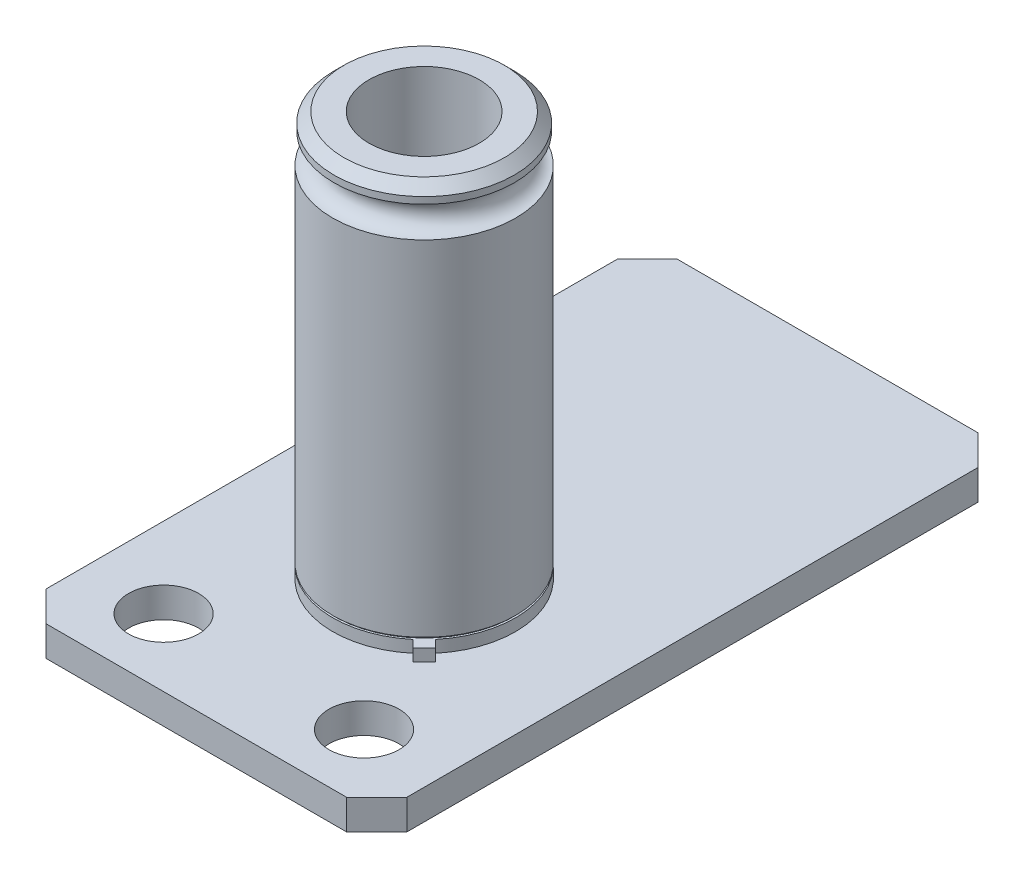
ISO-10303-21;
HEADER;
FILE_DESCRIPTION(('STEP AP214'),'2;1');
FILE_NAME('part.step','',(''),(''),'','','');
FILE_SCHEMA(('AUTOMOTIVE_DESIGN { 1 0 10303 214 1 1 1 1 }'));
ENDSEC;
DATA;
#1=APPLICATION_CONTEXT('core data for automotive mechanical design processes');
#2=APPLICATION_PROTOCOL_DEFINITION('international standard','automotive_design',2000,#1);
#3=PRODUCT_CONTEXT('',#1,'mechanical');
#4=PRODUCT('Part','Part','',(#3));
#5=PRODUCT_RELATED_PRODUCT_CATEGORY('part','',(#4));
#6=PRODUCT_DEFINITION_FORMATION('','',#4);
#7=PRODUCT_DEFINITION_CONTEXT('part definition',#1,'design');
#8=PRODUCT_DEFINITION('design','',#6,#7);
#9=PRODUCT_DEFINITION_SHAPE('','',#8);
#10=(LENGTH_UNIT() NAMED_UNIT(*) SI_UNIT(.MILLI.,.METRE.));
#11=(NAMED_UNIT(*) PLANE_ANGLE_UNIT() SI_UNIT($,.RADIAN.));
#12=(NAMED_UNIT(*) SI_UNIT($,.STERADIAN.) SOLID_ANGLE_UNIT());
#13=UNCERTAINTY_MEASURE_WITH_UNIT(LENGTH_MEASURE(1.E-05),#10,'distance_accuracy_value','');
#14=(GEOMETRIC_REPRESENTATION_CONTEXT(3) GLOBAL_UNCERTAINTY_ASSIGNED_CONTEXT((#13)) GLOBAL_UNIT_ASSIGNED_CONTEXT((#10,
#11,#12)) REPRESENTATION_CONTEXT('',''));
#15=CARTESIAN_POINT('',(0.,0.,0.));
#16=DIRECTION('',(0.,0.,1.));
#17=DIRECTION('',(1.,0.,0.));
#18=AXIS2_PLACEMENT_3D('',#15,#16,#17);
#19=CARTESIAN_POINT('',(-4.46,0.,0.));
#20=DIRECTION('',(0.,1.,0.));
#21=DIRECTION('',(-1.,0.,0.));
#22=AXIS2_PLACEMENT_3D('',#19,#20,#21);
#23=PLANE('',#22);
#24=CARTESIAN_POINT('',(0.,0.,0.));
#25=DIRECTION('',(0.,1.,0.));
#26=DIRECTION('',(-1.,0.,0.));
#27=AXIS2_PLACEMENT_3D('',#24,#25,#26);
#28=CIRCLE('',#27,4.46);
#29=CARTESIAN_POINT('',(-4.46,0.,0.));
#30=VERTEX_POINT('',#29);
#31=EDGE_CURVE('E223',#30,#30,#28,.T.);
#32=ORIENTED_EDGE('',*,*,#31,.T.);
#33=EDGE_LOOP('',(#32));
#34=FACE_BOUND('',#33,.T.);
#35=ADVANCED_FACE('F43',(#34),#23,.T.);
#36=CARTESIAN_POINT('',(0.,0.,0.));
#37=DIRECTION('',(0.,1.,0.));
#38=DIRECTION('',(-1.,0.,0.));
#39=AXIS2_PLACEMENT_3D('',#36,#37,#38);
#40=CYLINDRICAL_SURFACE('',#39,4.56);
#41=DIRECTION('',(0.,1.,0.));
#42=VECTOR('',#41,1.);
#43=CARTESIAN_POINT('',(2.92913487150693,0.,3.49482029645618));
#44=LINE('',#43,#42);
#45=CARTESIAN_POINT('',(2.92913487150693,-0.0999999999999991,3.49482029645618));
#46=VERTEX_POINT('',#45);
#47=CARTESIAN_POINT('',(2.92913487150693,-0.699999999999999,3.49482029645618));
#48=VERTEX_POINT('',#47);
#49=EDGE_CURVE('E220',#46,#48,#44,.F.);
#50=ORIENTED_EDGE('',*,*,#49,.F.);
#51=CARTESIAN_POINT('',(0.,-0.0999999999999995,0.));
#52=DIRECTION('',(0.,1.,0.));
#53=DIRECTION('',(-1.,0.,0.));
#54=AXIS2_PLACEMENT_3D('',#51,#52,#53);
#55=CIRCLE('',#54,4.56);
#56=CARTESIAN_POINT('',(3.49482029645617,-0.099999999999999,2.92913487150694));
#57=VERTEX_POINT('',#56);
#58=EDGE_CURVE('E229',#57,#46,#55,.T.);
#59=ORIENTED_EDGE('',*,*,#58,.F.);
#60=DIRECTION('',(0.,1.,0.));
#61=VECTOR('',#60,1.);
#62=CARTESIAN_POINT('',(3.49482029645617,0.,2.92913487150694));
#63=LINE('',#62,#61);
#64=CARTESIAN_POINT('',(3.49482029645617,-0.699999999999999,2.92913487150694));
#65=VERTEX_POINT('',#64);
#66=EDGE_CURVE('E217',#65,#57,#63,.T.);
#67=ORIENTED_EDGE('',*,*,#66,.F.);
#68=CARTESIAN_POINT('',(0.,-0.699999999999999,0.));
#69=DIRECTION('',(0.,1.,0.));
#70=DIRECTION('',(-1.,0.,0.));
#71=AXIS2_PLACEMENT_3D('',#68,#69,#70);
#72=CIRCLE('',#71,4.56);
#73=EDGE_CURVE('E232',#65,#48,#72,.T.);
#74=ORIENTED_EDGE('',*,*,#73,.T.);
#75=EDGE_LOOP('',(#50,#59,#67,#74));
#76=FACE_BOUND('',#75,.T.);
#77=ADVANCED_FACE('F341',(#76),#40,.T.);
#78=CARTESIAN_POINT('',(-4.56,-0.1,0.));
#79=DIRECTION('',(0.,1.,0.));
#80=DIRECTION('',(-1.,0.,0.));
#81=AXIS2_PLACEMENT_3D('',#78,#79,#80);
#82=PLANE('',#81);
#83=ORIENTED_EDGE('',*,*,#58,.T.);
#84=DIRECTION('',(-0.707106781186546,0.,-0.707106781186549));
#85=VECTOR('',#84,1.);
#86=CARTESIAN_POINT('',(-0.28284271247462,-0.0999999999999994,0.282842712474618));
#87=LINE('',#86,#85);
#88=CARTESIAN_POINT('',(3.2951176003293,-0.099999999999999,3.86080302527856));
#89=VERTEX_POINT('',#88);
#90=EDGE_CURVE('E202',#89,#46,#87,.T.);
#91=ORIENTED_EDGE('',*,*,#90,.F.);
#92=DIRECTION('',(-0.70710678118655,0.,0.707106781186545));
#93=VECTOR('',#92,1.);
#94=CARTESIAN_POINT('',(3.86080302527854,-0.0999999999999994,3.29511760032932));
#95=LINE('',#94,#93);
#96=CARTESIAN_POINT('',(3.86080302527854,-0.099999999999999,3.29511760032932));
#97=VERTEX_POINT('',#96);
#98=EDGE_CURVE('E208',#97,#89,#95,.T.);
#99=ORIENTED_EDGE('',*,*,#98,.F.);
#100=DIRECTION('',(0.707106781186546,0.,0.707106781186549));
#101=VECTOR('',#100,1.);
#102=CARTESIAN_POINT('',(0.28284271247462,-0.0999999999999994,-0.282842712474618));
#103=LINE('',#102,#101);
#104=EDGE_CURVE('E207',#57,#97,#103,.T.);
#105=ORIENTED_EDGE('',*,*,#104,.F.);
#106=EDGE_LOOP('',(#83,#91,#99,#105));
#107=FACE_BOUND('',#106,.T.);
#108=CARTESIAN_POINT('',(0.,-0.0999999999999995,0.));
#109=DIRECTION('',(0.,1.,0.));
#110=DIRECTION('',(-1.,0.,0.));
#111=AXIS2_PLACEMENT_3D('',#108,#109,#110);
#112=CIRCLE('',#111,4.46);
#113=CARTESIAN_POINT('',(-4.46,-0.1,0.));
#114=VERTEX_POINT('',#113);
#115=EDGE_CURVE('E226',#114,#114,#112,.T.);
#116=ORIENTED_EDGE('',*,*,#115,.F.);
#117=EDGE_LOOP('',(#116));
#118=FACE_BOUND('',#117,.T.);
#119=ADVANCED_FACE('F346',(#107,#118),#82,.T.);
#120=CARTESIAN_POINT('',(0.,0.,0.));
#121=DIRECTION('',(0.,1.,0.));
#122=DIRECTION('',(-1.,0.,0.));
#123=AXIS2_PLACEMENT_3D('',#120,#121,#122);
#124=CYLINDRICAL_SURFACE('',#123,4.46);
#125=ORIENTED_EDGE('',*,*,#115,.T.);
#126=EDGE_LOOP('',(#125));
#127=FACE_BOUND('',#126,.T.);
#128=ORIENTED_EDGE('',*,*,#31,.F.);
#129=EDGE_LOOP('',(#128));
#130=FACE_BOUND('',#129,.T.);
#131=ADVANCED_FACE('F350',(#127,#130),#124,.T.);
#132=CARTESIAN_POINT('',(-0.28284271247462,5.76,0.282842712474618));
#133=DIRECTION('',(-0.707106781186549,0.,0.707106781186546));
#134=DIRECTION('',(0.707106781186546,0.,0.707106781186549));
#135=AXIS2_PLACEMENT_3D('',#132,#133,#134);
#136=PLANE('',#135);
#137=ORIENTED_EDGE('',*,*,#90,.T.);
#138=ORIENTED_EDGE('',*,*,#49,.T.);
#139=DIRECTION('',(-0.707106781186546,0.,-0.707106781186549));
#140=VECTOR('',#139,1.);
#141=CARTESIAN_POINT('',(-0.282842712474619,-0.699999999999999,0.282842712474618));
#142=LINE('',#141,#140);
#143=CARTESIAN_POINT('',(3.2951176003293,-0.699999999999999,3.86080302527856));
#144=VERTEX_POINT('',#143);
#145=EDGE_CURVE('E198',#144,#48,#142,.T.);
#146=ORIENTED_EDGE('',*,*,#145,.F.);
#147=DIRECTION('',(0.,-1.,0.));
#148=VECTOR('',#147,1.);
#149=CARTESIAN_POINT('',(3.2951176003293,5.76,3.86080302527856));
#150=LINE('',#149,#148);
#151=EDGE_CURVE('E211',#89,#144,#150,.T.);
#152=ORIENTED_EDGE('',*,*,#151,.F.);
#153=EDGE_LOOP('',(#137,#138,#146,#152));
#154=FACE_BOUND('',#153,.T.);
#155=ADVANCED_FACE('F352',(#154),#136,.T.);
#156=CARTESIAN_POINT('',(0.282842712474619,5.76,-0.282842712474618));
#157=DIRECTION('',(0.707106781186549,0.,-0.707106781186546));
#158=DIRECTION('',(-0.707106781186546,0.,-0.707106781186549));
#159=AXIS2_PLACEMENT_3D('',#156,#157,#158);
#160=PLANE('',#159);
#161=DIRECTION('',(0.707106781186546,0.,0.707106781186549));
#162=VECTOR('',#161,1.);
#163=CARTESIAN_POINT('',(0.28284271247462,-0.699999999999999,-0.282842712474618));
#164=LINE('',#163,#162);
#165=CARTESIAN_POINT('',(3.86080302527854,-0.699999999999999,3.29511760032932));
#166=VERTEX_POINT('',#165);
#167=EDGE_CURVE('E199',#65,#166,#164,.T.);
#168=ORIENTED_EDGE('',*,*,#167,.F.);
#169=ORIENTED_EDGE('',*,*,#66,.T.);
#170=ORIENTED_EDGE('',*,*,#104,.T.);
#171=DIRECTION('',(0.,-1.,0.));
#172=VECTOR('',#171,1.);
#173=CARTESIAN_POINT('',(3.86080302527854,5.76,3.29511760032932));
#174=LINE('',#173,#172);
#175=EDGE_CURVE('E212',#97,#166,#174,.T.);
#176=ORIENTED_EDGE('',*,*,#175,.T.);
#177=EDGE_LOOP('',(#168,#169,#170,#176));
#178=FACE_BOUND('',#177,.T.);
#179=ADVANCED_FACE('F359',(#178),#160,.T.);
#180=CARTESIAN_POINT('',(3.86080302527854,5.76,3.29511760032932));
#181=DIRECTION('',(0.707106781186545,0.,0.70710678118655));
#182=DIRECTION('',(0.70710678118655,0.,-0.707106781186545));
#183=AXIS2_PLACEMENT_3D('',#180,#181,#182);
#184=PLANE('',#183);
#185=ORIENTED_EDGE('',*,*,#175,.F.);
#186=ORIENTED_EDGE('',*,*,#98,.T.);
#187=ORIENTED_EDGE('',*,*,#151,.T.);
#188=DIRECTION('',(-0.70710678118655,0.,0.707106781186545));
#189=VECTOR('',#188,1.);
#190=CARTESIAN_POINT('',(3.86080302527854,-0.699999999999999,3.29511760032932));
#191=LINE('',#190,#189);
#192=EDGE_CURVE('E195',#166,#144,#191,.T.);
#193=ORIENTED_EDGE('',*,*,#192,.F.);
#194=EDGE_LOOP('',(#185,#186,#187,#193));
#195=FACE_BOUND('',#194,.T.);
#196=ADVANCED_FACE('F367',(#195),#184,.T.);
#197=CARTESIAN_POINT('',(9.,-2.2,11.3671159111135));
#198=DIRECTION('',(0.,0.,-1.));
#199=DIRECTION('',(-1.,0.,0.));
#200=AXIS2_PLACEMENT_3D('',#197,#198,#199);
#201=PLANE('',#200);
#202=DIRECTION('',(-1.,0.,0.));
#203=VECTOR('',#202,1.);
#204=CARTESIAN_POINT('',(9.,-2.2,11.3671159111135));
#205=LINE('',#204,#203);
#206=CARTESIAN_POINT('',(7.50000000000001,-2.2,11.3671159111135));
#207=VERTEX_POINT('',#206);
#208=CARTESIAN_POINT('',(-7.5,-2.2,11.3671159111135));
#209=VERTEX_POINT('',#208);
#210=EDGE_CURVE('E170',#207,#209,#205,.T.);
#211=ORIENTED_EDGE('',*,*,#210,.F.);
#212=DIRECTION('',(0.,1.,0.));
#213=VECTOR('',#212,1.);
#214=CARTESIAN_POINT('',(7.50000000000001,-14.2,11.3671159111135));
#215=LINE('',#214,#213);
#216=CARTESIAN_POINT('',(7.50000000000001,-0.699999999999998,11.3671159111135));
#217=VERTEX_POINT('',#216);
#218=EDGE_CURVE('E57',#207,#217,#215,.T.);
#219=ORIENTED_EDGE('',*,*,#218,.T.);
#220=DIRECTION('',(-1.,0.,0.));
#221=VECTOR('',#220,1.);
#222=CARTESIAN_POINT('',(9.,-0.699999999999998,11.3671159111135));
#223=LINE('',#222,#221);
#224=CARTESIAN_POINT('',(-7.5,-0.7,11.3671159111135));
#225=VERTEX_POINT('',#224);
#226=EDGE_CURVE('E146',#217,#225,#223,.T.);
#227=ORIENTED_EDGE('',*,*,#226,.T.);
#228=DIRECTION('',(0.,1.,0.));
#229=VECTOR('',#228,1.);
#230=CARTESIAN_POINT('',(-7.5,-14.2,11.3671159111135));
#231=LINE('',#230,#229);
#232=EDGE_CURVE('E305',#209,#225,#231,.T.);
#233=ORIENTED_EDGE('',*,*,#232,.F.);
#234=EDGE_LOOP('',(#211,#219,#227,#233));
#235=FACE_BOUND('',#234,.T.);
#236=ADVANCED_FACE('F321',(#235),#201,.F.);
#237=CARTESIAN_POINT('',(9.,-2.2,-11.3671159111135));
#238=DIRECTION('',(-1.,0.,0.));
#239=DIRECTION('',(0.,0.,1.));
#240=AXIS2_PLACEMENT_3D('',#237,#238,#239);
#241=PLANE('',#240);
#242=DIRECTION('',(0.,0.,1.));
#243=VECTOR('',#242,1.);
#244=CARTESIAN_POINT('',(9.,-0.699999999999998,-11.3671159111135));
#245=LINE('',#244,#243);
#246=CARTESIAN_POINT('',(9.00000000000001,-0.699999999999998,-18.6328840888865));
#247=VERTEX_POINT('',#246);
#248=CARTESIAN_POINT('',(9.00000000000001,-0.699999999999998,9.86711591111348));
#249=VERTEX_POINT('',#248);
#250=EDGE_CURVE('E144',#247,#249,#245,.T.);
#251=ORIENTED_EDGE('',*,*,#250,.T.);
#252=DIRECTION('',(0.,1.,0.));
#253=VECTOR('',#252,1.);
#254=CARTESIAN_POINT('',(9.00000000000001,-14.2,9.86711591111348));
#255=LINE('',#254,#253);
#256=CARTESIAN_POINT('',(9.00000000000001,-2.2,9.86711591111348));
#257=VERTEX_POINT('',#256);
#258=EDGE_CURVE('E129',#257,#249,#255,.T.);
#259=ORIENTED_EDGE('',*,*,#258,.F.);
#260=DIRECTION('',(0.,0.,1.));
#261=VECTOR('',#260,1.);
#262=CARTESIAN_POINT('',(9.,-2.2,-11.3671159111135));
#263=LINE('',#262,#261);
#264=CARTESIAN_POINT('',(9.,-2.2,-18.6328840888865));
#265=VERTEX_POINT('',#264);
#266=EDGE_CURVE('E279',#265,#257,#263,.T.);
#267=ORIENTED_EDGE('',*,*,#266,.F.);
#268=DIRECTION('',(0.,1.,0.));
#269=VECTOR('',#268,1.);
#270=CARTESIAN_POINT('',(9.00000000000001,-14.2,-18.6328840888865));
#271=LINE('',#270,#269);
#272=EDGE_CURVE('E65',#265,#247,#271,.T.);
#273=ORIENTED_EDGE('',*,*,#272,.T.);
#274=EDGE_LOOP('',(#251,#259,#267,#273));
#275=FACE_BOUND('',#274,.T.);
#276=ADVANCED_FACE('F148',(#275),#241,.F.);
#277=CARTESIAN_POINT('',(-9.,-2.2,-20.1328840888865));
#278=DIRECTION('',(0.,0.,1.));
#279=DIRECTION('',(1.,0.,0.));
#280=AXIS2_PLACEMENT_3D('',#277,#278,#279);
#281=PLANE('',#280);
#282=DIRECTION('',(1.,0.,0.));
#283=VECTOR('',#282,1.);
#284=CARTESIAN_POINT('',(-9.,-0.7,-20.1328840888865));
#285=LINE('',#284,#283);
#286=CARTESIAN_POINT('',(-7.5,-0.7,-20.1328840888865));
#287=VERTEX_POINT('',#286);
#288=CARTESIAN_POINT('',(7.50000000000001,-0.699999999999998,-20.1328840888865));
#289=VERTEX_POINT('',#288);
#290=EDGE_CURVE('E149',#287,#289,#285,.T.);
#291=ORIENTED_EDGE('',*,*,#290,.T.);
#292=DIRECTION('',(0.,1.,0.));
#293=VECTOR('',#292,1.);
#294=CARTESIAN_POINT('',(7.50000000000001,-14.2,-20.1328840888865));
#295=LINE('',#294,#293);
#296=CARTESIAN_POINT('',(7.50000000000001,-2.2,-20.1328840888865));
#297=VERTEX_POINT('',#296);
#298=EDGE_CURVE('E264',#297,#289,#295,.T.);
#299=ORIENTED_EDGE('',*,*,#298,.F.);
#300=DIRECTION('',(1.,0.,0.));
#301=VECTOR('',#300,1.);
#302=CARTESIAN_POINT('',(-9.,-2.2,-20.1328840888865));
#303=LINE('',#302,#301);
#304=CARTESIAN_POINT('',(-7.5,-2.2,-20.1328840888865));
#305=VERTEX_POINT('',#304);
#306=EDGE_CURVE('E271',#305,#297,#303,.T.);
#307=ORIENTED_EDGE('',*,*,#306,.F.);
#308=DIRECTION('',(0.,1.,0.));
#309=VECTOR('',#308,1.);
#310=CARTESIAN_POINT('',(-7.5,-14.2,-20.1328840888865));
#311=LINE('',#310,#309);
#312=EDGE_CURVE('E313',#305,#287,#311,.T.);
#313=ORIENTED_EDGE('',*,*,#312,.T.);
#314=EDGE_LOOP('',(#291,#299,#307,#313));
#315=FACE_BOUND('',#314,.T.);
#316=ADVANCED_FACE('F269',(#315),#281,.F.);
#317=CARTESIAN_POINT('',(0.,-0.699999999999999,0.));
#318=DIRECTION('',(0.,-1.,0.));
#319=DIRECTION('',(1.,0.,0.));
#320=AXIS2_PLACEMENT_3D('',#317,#318,#319);
#321=PLANE('',#320);
#322=CARTESIAN_POINT('',(5.,-0.699999999999999,8.));
#323=DIRECTION('',(0.,1.,0.));
#324=DIRECTION('',(-1.,0.,0.));
#325=AXIS2_PLACEMENT_3D('',#322,#323,#324);
#326=CIRCLE('',#325,1.75);
#327=CARTESIAN_POINT('',(3.25,-0.699999999999999,8.));
#328=VERTEX_POINT('',#327);
#329=EDGE_CURVE('E258',#328,#328,#326,.T.);
#330=ORIENTED_EDGE('',*,*,#329,.F.);
#331=EDGE_LOOP('',(#330));
#332=FACE_BOUND('',#331,.T.);
#333=CARTESIAN_POINT('',(-5.,-0.7,8.));
#334=DIRECTION('',(0.,1.,0.));
#335=DIRECTION('',(-1.,0.,0.));
#336=AXIS2_PLACEMENT_3D('',#333,#334,#335);
#337=CIRCLE('',#336,1.75);
#338=CARTESIAN_POINT('',(-6.75,-0.7,8.));
#339=VERTEX_POINT('',#338);
#340=EDGE_CURVE('E254',#339,#339,#337,.T.);
#341=ORIENTED_EDGE('',*,*,#340,.F.);
#342=EDGE_LOOP('',(#341));
#343=FACE_BOUND('',#342,.T.);
#344=ORIENTED_EDGE('',*,*,#226,.F.);
#345=DIRECTION('',(-0.707106781186548,0.,0.707106781186548));
#346=VECTOR('',#345,1.);
#347=CARTESIAN_POINT('',(9.00000000000001,-0.699999999999998,9.86711591111348));
#348=LINE('',#347,#346);
#349=EDGE_CURVE('E132',#249,#217,#348,.T.);
#350=ORIENTED_EDGE('',*,*,#349,.F.);
#351=ORIENTED_EDGE('',*,*,#250,.F.);
#352=DIRECTION('',(0.707106781186546,0.,0.707106781186549));
#353=VECTOR('',#352,1.);
#354=CARTESIAN_POINT('',(9.00000000000001,-0.699999999999998,-18.6328840888865));
#355=LINE('',#354,#353);
#356=EDGE_CURVE('E273',#289,#247,#355,.T.);
#357=ORIENTED_EDGE('',*,*,#356,.F.);
#358=ORIENTED_EDGE('',*,*,#290,.F.);
#359=DIRECTION('',(0.707106781186548,0.,-0.707106781186547));
#360=VECTOR('',#359,1.);
#361=CARTESIAN_POINT('',(-9.,-0.7,-18.6328840888865));
#362=LINE('',#361,#360);
#363=CARTESIAN_POINT('',(-9.,-0.7,-18.6328840888865));
#364=VERTEX_POINT('',#363);
#365=EDGE_CURVE('E314',#364,#287,#362,.T.);
#366=ORIENTED_EDGE('',*,*,#365,.F.);
#367=DIRECTION('',(0.,0.,-1.));
#368=VECTOR('',#367,1.);
#369=CARTESIAN_POINT('',(-9.,-0.7,-14.7227108509228));
#370=LINE('',#369,#368);
#371=CARTESIAN_POINT('',(-9.,-0.7,9.86711591111348));
#372=VERTEX_POINT('',#371);
#373=EDGE_CURVE('E154',#372,#364,#370,.T.);
#374=ORIENTED_EDGE('',*,*,#373,.F.);
#375=DIRECTION('',(-0.707106781186548,0.,-0.707106781186548));
#376=VECTOR('',#375,1.);
#377=CARTESIAN_POINT('',(-9.,-0.7,9.86711591111348));
#378=LINE('',#377,#376);
#379=EDGE_CURVE('E308',#225,#372,#378,.T.);
#380=ORIENTED_EDGE('',*,*,#379,.F.);
#381=EDGE_LOOP('',(#344,#350,#351,#357,#358,#366,#374,#380));
#382=FACE_BOUND('',#381,.T.);
#383=ORIENTED_EDGE('',*,*,#73,.F.);
#384=ORIENTED_EDGE('',*,*,#167,.T.);
#385=ORIENTED_EDGE('',*,*,#192,.T.);
#386=ORIENTED_EDGE('',*,*,#145,.T.);
#387=EDGE_LOOP('',(#383,#384,#385,#386));
#388=FACE_BOUND('',#387,.T.);
#389=ADVANCED_FACE('F141',(#332,#343,#382,#388),#321,.F.);
#390=CARTESIAN_POINT('',(-9.,-2.2,-14.7227108509228));
#391=DIRECTION('',(1.,0.,0.));
#392=DIRECTION('',(0.,0.,-1.));
#393=AXIS2_PLACEMENT_3D('',#390,#391,#392);
#394=PLANE('',#393);
#395=ORIENTED_EDGE('',*,*,#373,.T.);
#396=DIRECTION('',(0.,1.,0.));
#397=VECTOR('',#396,1.);
#398=CARTESIAN_POINT('',(-9.,-14.2,-18.6328840888865));
#399=LINE('',#398,#397);
#400=CARTESIAN_POINT('',(-9.,-2.2,-18.6328840888865));
#401=VERTEX_POINT('',#400);
#402=EDGE_CURVE('E311',#401,#364,#399,.T.);
#403=ORIENTED_EDGE('',*,*,#402,.F.);
#404=DIRECTION('',(0.,0.,-1.));
#405=VECTOR('',#404,1.);
#406=CARTESIAN_POINT('',(-9.,-2.2,-14.7227108509228));
#407=LINE('',#406,#405);
#408=CARTESIAN_POINT('',(-9.00000000000001,-2.2,9.86711591111347));
#409=VERTEX_POINT('',#408);
#410=EDGE_CURVE('E151',#409,#401,#407,.T.);
#411=ORIENTED_EDGE('',*,*,#410,.F.);
#412=DIRECTION('',(0.,1.,0.));
#413=VECTOR('',#412,1.);
#414=CARTESIAN_POINT('',(-9.,-14.2,9.86711591111348));
#415=LINE('',#414,#413);
#416=EDGE_CURVE('E304',#409,#372,#415,.T.);
#417=ORIENTED_EDGE('',*,*,#416,.T.);
#418=EDGE_LOOP('',(#395,#403,#411,#417));
#419=FACE_BOUND('',#418,.T.);
#420=ADVANCED_FACE('F327',(#419),#394,.F.);
#421=CARTESIAN_POINT('',(0.,-2.2,0.));
#422=DIRECTION('',(0.,-1.,0.));
#423=DIRECTION('',(1.,0.,0.));
#424=AXIS2_PLACEMENT_3D('',#421,#422,#423);
#425=PLANE('',#424);
#426=DIRECTION('',(0.707106781186548,0.,-0.707106781186548));
#427=VECTOR('',#426,1.);
#428=CARTESIAN_POINT('',(9.43355795555674,-2.2,9.43355795555674));
#429=LINE('',#428,#427);
#430=EDGE_CURVE('E12',#207,#257,#429,.T.);
#431=ORIENTED_EDGE('',*,*,#430,.F.);
#432=ORIENTED_EDGE('',*,*,#210,.T.);
#433=DIRECTION('',(0.707106781186548,0.,0.707106781186548));
#434=VECTOR('',#433,1.);
#435=CARTESIAN_POINT('',(-9.43355795555674,-2.2,9.43355795555674));
#436=LINE('',#435,#434);
#437=EDGE_CURVE('E165',#409,#209,#436,.T.);
#438=ORIENTED_EDGE('',*,*,#437,.F.);
#439=ORIENTED_EDGE('',*,*,#410,.T.);
#440=DIRECTION('',(-0.707106781186548,0.,0.707106781186547));
#441=VECTOR('',#440,1.);
#442=CARTESIAN_POINT('',(-13.8164420444433,-2.2,-13.8164420444433));
#443=LINE('',#442,#441);
#444=EDGE_CURVE('E261',#305,#401,#443,.T.);
#445=ORIENTED_EDGE('',*,*,#444,.F.);
#446=ORIENTED_EDGE('',*,*,#306,.T.);
#447=DIRECTION('',(-0.707106781186546,0.,-0.707106781186549));
#448=VECTOR('',#447,1.);
#449=CARTESIAN_POINT('',(13.8164420444433,-2.2,-13.8164420444432));
#450=LINE('',#449,#448);
#451=EDGE_CURVE('E51',#265,#297,#450,.T.);
#452=ORIENTED_EDGE('',*,*,#451,.F.);
#453=ORIENTED_EDGE('',*,*,#266,.T.);
#454=EDGE_LOOP('',(#431,#432,#438,#439,#445,#446,#452,#453));
#455=FACE_BOUND('',#454,.T.);
#456=CARTESIAN_POINT('',(5.,-2.2,8.));
#457=DIRECTION('',(0.,-1.,0.));
#458=DIRECTION('',(1.,0.,0.));
#459=AXIS2_PLACEMENT_3D('',#456,#457,#458);
#460=CIRCLE('',#459,1.75);
#461=CARTESIAN_POINT('',(6.75,-2.2,8.));
#462=VERTEX_POINT('',#461);
#463=EDGE_CURVE('E255',#462,#462,#460,.T.);
#464=ORIENTED_EDGE('',*,*,#463,.F.);
#465=EDGE_LOOP('',(#464));
#466=FACE_BOUND('',#465,.T.);
#467=CARTESIAN_POINT('',(-5.,-2.2,8.));
#468=DIRECTION('',(0.,-1.,0.));
#469=DIRECTION('',(1.,0.,0.));
#470=AXIS2_PLACEMENT_3D('',#467,#468,#469);
#471=CIRCLE('',#470,1.75);
#472=CARTESIAN_POINT('',(-3.25,-2.2,8.));
#473=VERTEX_POINT('',#472);
#474=EDGE_CURVE('E251',#473,#473,#471,.T.);
#475=ORIENTED_EDGE('',*,*,#474,.F.);
#476=EDGE_LOOP('',(#475));
#477=FACE_BOUND('',#476,.T.);
#478=CARTESIAN_POINT('',(0.,-2.2,2.54));
#479=DIRECTION('',(0.,-1.,0.));
#480=DIRECTION('',(1.,0.,0.));
#481=AXIS2_PLACEMENT_3D('',#478,#479,#480);
#482=CIRCLE('',#481,0.225);
#483=CARTESIAN_POINT('',(0.225,-2.2,2.54));
#484=VERTEX_POINT('',#483);
#485=EDGE_CURVE('E183',#484,#484,#482,.T.);
#486=ORIENTED_EDGE('',*,*,#485,.F.);
#487=EDGE_LOOP('',(#486));
#488=FACE_BOUND('',#487,.T.);
#489=CARTESIAN_POINT('',(2.54,-2.2,0.));
#490=DIRECTION('',(0.,-1.,0.));
#491=DIRECTION('',(1.,0.,0.));
#492=AXIS2_PLACEMENT_3D('',#489,#490,#491);
#493=CIRCLE('',#492,0.225);
#494=CARTESIAN_POINT('',(2.765,-2.2,0.));
#495=VERTEX_POINT('',#494);
#496=EDGE_CURVE('E180',#495,#495,#493,.T.);
#497=ORIENTED_EDGE('',*,*,#496,.F.);
#498=EDGE_LOOP('',(#497));
#499=FACE_BOUND('',#498,.T.);
#500=CARTESIAN_POINT('',(0.,-2.2,-2.54));
#501=DIRECTION('',(0.,-1.,0.));
#502=DIRECTION('',(1.,0.,0.));
#503=AXIS2_PLACEMENT_3D('',#500,#501,#502);
#504=CIRCLE('',#503,0.225);
#505=CARTESIAN_POINT('',(0.225,-2.2,-2.54));
#506=VERTEX_POINT('',#505);
#507=EDGE_CURVE('E177',#506,#506,#504,.T.);
#508=ORIENTED_EDGE('',*,*,#507,.F.);
#509=EDGE_LOOP('',(#508));
#510=FACE_BOUND('',#509,.T.);
#511=CARTESIAN_POINT('',(-2.54,-2.2,0.));
#512=DIRECTION('',(0.,-1.,0.));
#513=DIRECTION('',(1.,0.,0.));
#514=AXIS2_PLACEMENT_3D('',#511,#512,#513);
#515=CIRCLE('',#514,0.225);
#516=CARTESIAN_POINT('',(-2.315,-2.2,0.));
#517=VERTEX_POINT('',#516);
#518=EDGE_CURVE('E176',#517,#517,#515,.T.);
#519=ORIENTED_EDGE('',*,*,#518,.F.);
#520=EDGE_LOOP('',(#519));
#521=FACE_BOUND('',#520,.T.);
#522=ADVANCED_FACE('F276',(#455,#466,#477,#488,#499,#510,#521),#425,.T.);
#523=CARTESIAN_POINT('',(0.,-13.1,-2.54));
#524=DIRECTION('',(0.,1.,0.));
#525=DIRECTION('',(-1.,0.,0.));
#526=AXIS2_PLACEMENT_3D('',#523,#524,#525);
#527=CYLINDRICAL_SURFACE('',#526,0.225);
#528=CARTESIAN_POINT('',(0.,-2.43755455334988,-2.54));
#529=DIRECTION('',(0.,1.,0.));
#530=DIRECTION('',(-1.,0.,0.));
#531=AXIS2_PLACEMENT_3D('',#528,#529,#530);
#532=CIRCLE('',#531,0.225);
#533=CARTESIAN_POINT('',(-0.225,-2.43755455334988,-2.54));
#534=VERTEX_POINT('',#533);
#535=EDGE_CURVE('E286',#534,#534,#532,.T.);
#536=ORIENTED_EDGE('',*,*,#535,.T.);
#537=EDGE_LOOP('',(#536));
#538=FACE_BOUND('',#537,.T.);
#539=ORIENTED_EDGE('',*,*,#507,.T.);
#540=EDGE_LOOP('',(#539));
#541=FACE_BOUND('',#540,.T.);
#542=ADVANCED_FACE('F415',(#538,#541),#527,.T.);
#543=CARTESIAN_POINT('',(2.54,-13.1,0.));
#544=DIRECTION('',(0.,1.,0.));
#545=DIRECTION('',(-1.,0.,0.));
#546=AXIS2_PLACEMENT_3D('',#543,#544,#545);
#547=CYLINDRICAL_SURFACE('',#546,0.225);
#548=CARTESIAN_POINT('',(2.54,-2.43755455334988,0.));
#549=DIRECTION('',(0.,1.,0.));
#550=DIRECTION('',(-1.,0.,0.));
#551=AXIS2_PLACEMENT_3D('',#548,#549,#550);
#552=CIRCLE('',#551,0.225);
#553=CARTESIAN_POINT('',(2.315,-2.43755455334988,0.));
#554=VERTEX_POINT('',#553);
#555=EDGE_CURVE('E292',#554,#554,#552,.T.);
#556=ORIENTED_EDGE('',*,*,#555,.T.);
#557=EDGE_LOOP('',(#556));
#558=FACE_BOUND('',#557,.T.);
#559=ORIENTED_EDGE('',*,*,#496,.T.);
#560=EDGE_LOOP('',(#559));
#561=FACE_BOUND('',#560,.T.);
#562=ADVANCED_FACE('F411',(#558,#561),#547,.T.);
#563=CARTESIAN_POINT('',(0.,-13.1,2.54));
#564=DIRECTION('',(0.,1.,0.));
#565=DIRECTION('',(-1.,0.,0.));
#566=AXIS2_PLACEMENT_3D('',#563,#564,#565);
#567=CYLINDRICAL_SURFACE('',#566,0.225);
#568=CARTESIAN_POINT('',(0.,-2.43755455334988,2.54));
#569=DIRECTION('',(0.,1.,0.));
#570=DIRECTION('',(-1.,0.,0.));
#571=AXIS2_PLACEMENT_3D('',#568,#569,#570);
#572=CIRCLE('',#571,0.225);
#573=CARTESIAN_POINT('',(-0.225,-2.43755455334988,2.54));
#574=VERTEX_POINT('',#573);
#575=EDGE_CURVE('E250',#574,#574,#572,.T.);
#576=ORIENTED_EDGE('',*,*,#575,.T.);
#577=EDGE_LOOP('',(#576));
#578=FACE_BOUND('',#577,.T.);
#579=ORIENTED_EDGE('',*,*,#485,.T.);
#580=EDGE_LOOP('',(#579));
#581=FACE_BOUND('',#580,.T.);
#582=ADVANCED_FACE('F407',(#578,#581),#567,.T.);
#583=CARTESIAN_POINT('',(-2.54,-13.1,0.));
#584=DIRECTION('',(0.,1.,0.));
#585=DIRECTION('',(-1.,0.,0.));
#586=AXIS2_PLACEMENT_3D('',#583,#584,#585);
#587=CYLINDRICAL_SURFACE('',#586,0.225);
#588=CARTESIAN_POINT('',(-2.54,-2.43755455334988,0.));
#589=DIRECTION('',(0.,1.,0.));
#590=DIRECTION('',(-1.,0.,0.));
#591=AXIS2_PLACEMENT_3D('',#588,#589,#590);
#592=CIRCLE('',#591,0.225);
#593=CARTESIAN_POINT('',(-2.765,-2.43755455334988,0.));
#594=VERTEX_POINT('',#593);
#595=EDGE_CURVE('E247',#594,#594,#592,.T.);
#596=ORIENTED_EDGE('',*,*,#595,.T.);
#597=EDGE_LOOP('',(#596));
#598=FACE_BOUND('',#597,.T.);
#599=ORIENTED_EDGE('',*,*,#518,.T.);
#600=EDGE_LOOP('',(#599));
#601=FACE_BOUND('',#600,.T.);
#602=ADVANCED_FACE('F410',(#598,#601),#587,.T.);
#603=CARTESIAN_POINT('',(4.5,-2.43755455334988,-2.93327593557546));
#604=DIRECTION('',(0.,1.,0.));
#605=DIRECTION('',(-1.,0.,0.));
#606=AXIS2_PLACEMENT_3D('',#603,#604,#605);
#607=PLANE('',#606);
#608=ORIENTED_EDGE('',*,*,#595,.F.);
#609=EDGE_LOOP('',(#608));
#610=FACE_BOUND('',#609,.T.);
#611=ADVANCED_FACE('F421',(#610),#607,.F.);
#612=ORIENTED_EDGE('',*,*,#575,.F.);
#613=EDGE_LOOP('',(#612));
#614=FACE_BOUND('',#613,.T.);
#615=ADVANCED_FACE('F552',(#614),#607,.F.);
#616=ORIENTED_EDGE('',*,*,#555,.F.);
#617=EDGE_LOOP('',(#616));
#618=FACE_BOUND('',#617,.T.);
#619=ADVANCED_FACE('F440',(#618),#607,.F.);
#620=ORIENTED_EDGE('',*,*,#535,.F.);
#621=EDGE_LOOP('',(#620));
#622=FACE_BOUND('',#621,.T.);
#623=ADVANCED_FACE('F436',(#622),#607,.F.);
#624=CARTESIAN_POINT('',(-5.,-14.2,8.));
#625=DIRECTION('',(0.,1.,0.));
#626=DIRECTION('',(-1.,0.,0.));
#627=AXIS2_PLACEMENT_3D('',#624,#625,#626);
#628=CYLINDRICAL_SURFACE('',#627,1.75);
#629=ORIENTED_EDGE('',*,*,#474,.T.);
#630=EDGE_LOOP('',(#629));
#631=FACE_BOUND('',#630,.T.);
#632=ORIENTED_EDGE('',*,*,#340,.T.);
#633=EDGE_LOOP('',(#632));
#634=FACE_BOUND('',#633,.T.);
#635=ADVANCED_FACE('F439',(#631,#634),#628,.F.);
#636=CARTESIAN_POINT('',(5.,-14.2,8.));
#637=DIRECTION('',(0.,1.,0.));
#638=DIRECTION('',(-1.,0.,0.));
#639=AXIS2_PLACEMENT_3D('',#636,#637,#638);
#640=CYLINDRICAL_SURFACE('',#639,1.75);
#641=ORIENTED_EDGE('',*,*,#463,.T.);
#642=EDGE_LOOP('',(#641));
#643=FACE_BOUND('',#642,.T.);
#644=ORIENTED_EDGE('',*,*,#329,.T.);
#645=EDGE_LOOP('',(#644));
#646=FACE_BOUND('',#645,.T.);
#647=ADVANCED_FACE('F338',(#643,#646),#640,.F.);
#648=CARTESIAN_POINT('',(-9.,-14.2,9.86711591111348));
#649=DIRECTION('',(0.707106781186547,0.,-0.707106781186547));
#650=DIRECTION('',(-0.707106781186548,0.,-0.707106781186548));
#651=AXIS2_PLACEMENT_3D('',#648,#649,#650);
#652=PLANE('',#651);
#653=ORIENTED_EDGE('',*,*,#437,.T.);
#654=ORIENTED_EDGE('',*,*,#232,.T.);
#655=ORIENTED_EDGE('',*,*,#379,.T.);
#656=ORIENTED_EDGE('',*,*,#416,.F.);
#657=EDGE_LOOP('',(#653,#654,#655,#656));
#658=FACE_BOUND('',#657,.T.);
#659=ADVANCED_FACE('F326',(#658),#652,.F.);
#660=CARTESIAN_POINT('',(-9.,-14.2,-18.6328840888865));
#661=DIRECTION('',(0.707106781186547,0.,0.707106781186548));
#662=DIRECTION('',(0.707106781186548,0.,-0.707106781186547));
#663=AXIS2_PLACEMENT_3D('',#660,#661,#662);
#664=PLANE('',#663);
#665=ORIENTED_EDGE('',*,*,#444,.T.);
#666=ORIENTED_EDGE('',*,*,#402,.T.);
#667=ORIENTED_EDGE('',*,*,#365,.T.);
#668=ORIENTED_EDGE('',*,*,#312,.F.);
#669=EDGE_LOOP('',(#665,#666,#667,#668));
#670=FACE_BOUND('',#669,.T.);
#671=ADVANCED_FACE('F330',(#670),#664,.F.);
#672=CARTESIAN_POINT('',(9.00000000000001,-14.2,-18.6328840888865));
#673=DIRECTION('',(-0.707106781186549,0.,0.707106781186546));
#674=DIRECTION('',(0.707106781186546,0.,0.707106781186549));
#675=AXIS2_PLACEMENT_3D('',#672,#673,#674);
#676=PLANE('',#675);
#677=ORIENTED_EDGE('',*,*,#451,.T.);
#678=ORIENTED_EDGE('',*,*,#298,.T.);
#679=ORIENTED_EDGE('',*,*,#356,.T.);
#680=ORIENTED_EDGE('',*,*,#272,.F.);
#681=EDGE_LOOP('',(#677,#678,#679,#680));
#682=FACE_BOUND('',#681,.T.);
#683=ADVANCED_FACE('F263',(#682),#676,.F.);
#684=CARTESIAN_POINT('',(9.00000000000001,-14.2,9.86711591111348));
#685=DIRECTION('',(-0.707106781186547,0.,-0.707106781186547));
#686=DIRECTION('',(-0.707106781186548,0.,0.707106781186548));
#687=AXIS2_PLACEMENT_3D('',#684,#685,#686);
#688=PLANE('',#687);
#689=ORIENTED_EDGE('',*,*,#430,.T.);
#690=ORIENTED_EDGE('',*,*,#258,.T.);
#691=ORIENTED_EDGE('',*,*,#349,.T.);
#692=ORIENTED_EDGE('',*,*,#218,.F.);
#693=EDGE_LOOP('',(#689,#690,#691,#692));
#694=FACE_BOUND('',#693,.T.);
#695=ADVANCED_FACE('F131',(#694),#688,.F.);
#696=CLOSED_SHELL('',(#35,#77,#119,#131,#155,#179,#196,#236,#276,#316,#389,#420,#522,#542,#562,
#582,#602,#611,#615,#619,#623,#635,#647,#659,#671,#683,#695));
#697=CARTESIAN_POINT('',(0.,-0.699999999999999,-2.54));
#698=DIRECTION('',(0.,-1.,0.));
#699=DIRECTION('',(1.,0.,0.));
#700=AXIS2_PLACEMENT_3D('',#697,#698,#699);
#701=CIRCLE('',#700,0.8);
#702=CARTESIAN_POINT('',(0.8,-0.699999999999999,-2.54));
#703=VERTEX_POINT('',#702);
#704=EDGE_CURVE('E169',#703,#703,#701,.F.);
#705=ORIENTED_EDGE('',*,*,#704,.T.);
#706=EDGE_LOOP('',(#705));
#707=FACE_BOUND('',#706,.T.);
#708=CARTESIAN_POINT('',(0.,-0.699999999999999,-2.54));
#709=DIRECTION('',(0.,-1.,0.));
#710=DIRECTION('',(1.,0.,0.));
#711=AXIS2_PLACEMENT_3D('',#708,#709,#710);
#712=CIRCLE('',#711,0.225);
#713=CARTESIAN_POINT('',(0.225,-0.699999999999999,-2.54));
#714=VERTEX_POINT('',#713);
#715=EDGE_CURVE('E158',#714,#714,#712,.T.);
#716=ORIENTED_EDGE('',*,*,#715,.T.);
#717=EDGE_LOOP('',(#716));
#718=FACE_BOUND('',#717,.T.);
#719=ADVANCED_FACE('F393',(#707,#718),#321,.F.);
#720=CARTESIAN_POINT('',(0.,2.16274169979695,-2.54));
#721=DIRECTION('',(0.,-1.,0.));
#722=DIRECTION('',(1.,0.,0.));
#723=AXIS2_PLACEMENT_3D('',#720,#721,#722);
#724=CYLINDRICAL_SURFACE('',#723,0.8);
#725=ORIENTED_EDGE('',*,*,#704,.F.);
#726=EDGE_LOOP('',(#725));
#727=FACE_BOUND('',#726,.T.);
#728=CARTESIAN_POINT('',(0.,-0.0999999999999994,-2.54));
#729=DIRECTION('',(0.,1.,0.));
#730=DIRECTION('',(-1.,0.,0.));
#731=AXIS2_PLACEMENT_3D('',#728,#729,#730);
#732=CIRCLE('',#731,0.8);
#733=CARTESIAN_POINT('',(-0.8,-0.0999999999999995,-2.54));
#734=VERTEX_POINT('',#733);
#735=EDGE_CURVE('E189',#734,#734,#732,.F.);
#736=ORIENTED_EDGE('',*,*,#735,.F.);
#737=EDGE_LOOP('',(#736));
#738=FACE_BOUND('',#737,.T.);
#739=ADVANCED_FACE('F388',(#727,#738),#724,.F.);
#740=CARTESIAN_POINT('',(-4.56,-0.1,0.));
#741=DIRECTION('',(0.,1.,0.));
#742=DIRECTION('',(-1.,0.,0.));
#743=AXIS2_PLACEMENT_3D('',#740,#741,#742);
#744=PLANE('',#743);
#745=CARTESIAN_POINT('',(0.,-0.0999999999999994,-2.54));
#746=DIRECTION('',(0.,1.,0.));
#747=DIRECTION('',(-1.,0.,0.));
#748=AXIS2_PLACEMENT_3D('',#745,#746,#747);
#749=CIRCLE('',#748,0.225);
#750=CARTESIAN_POINT('',(-0.225,-0.0999999999999994,-2.54));
#751=VERTEX_POINT('',#750);
#752=EDGE_CURVE('E237',#751,#751,#749,.F.);
#753=ORIENTED_EDGE('',*,*,#752,.F.);
#754=EDGE_LOOP('',(#753));
#755=FACE_BOUND('',#754,.T.);
#756=ORIENTED_EDGE('',*,*,#735,.T.);
#757=EDGE_LOOP('',(#756));
#758=FACE_BOUND('',#757,.T.);
#759=ADVANCED_FACE('F384',(#755,#758),#744,.F.);
#760=ORIENTED_EDGE('',*,*,#752,.T.);
#761=EDGE_LOOP('',(#760));
#762=FACE_BOUND('',#761,.T.);
#763=ORIENTED_EDGE('',*,*,#715,.F.);
#764=EDGE_LOOP('',(#763));
#765=FACE_BOUND('',#764,.T.);
#766=ADVANCED_FACE('F387',(#762,#765),#527,.T.);
#767=CLOSED_SHELL('',(#719,#739,#759,#766));
#768=CARTESIAN_POINT('',(-2.54,-0.7,0.));
#769=DIRECTION('',(0.,-1.,0.));
#770=DIRECTION('',(1.,0.,0.));
#771=AXIS2_PLACEMENT_3D('',#768,#769,#770);
#772=CIRCLE('',#771,0.8);
#773=CARTESIAN_POINT('',(-1.74,-0.7,0.));
#774=VERTEX_POINT('',#773);
#775=EDGE_CURVE('E166',#774,#774,#772,.F.);
#776=ORIENTED_EDGE('',*,*,#775,.T.);
#777=EDGE_LOOP('',(#776));
#778=FACE_BOUND('',#777,.T.);
#779=CARTESIAN_POINT('',(-2.54,-0.699999999999999,0.));
#780=DIRECTION('',(0.,-1.,0.));
#781=DIRECTION('',(1.,0.,0.));
#782=AXIS2_PLACEMENT_3D('',#779,#780,#781);
#783=CIRCLE('',#782,0.225);
#784=CARTESIAN_POINT('',(-2.315,-0.699999999999999,0.));
#785=VERTEX_POINT('',#784);
#786=EDGE_CURVE('E162',#785,#785,#783,.T.);
#787=ORIENTED_EDGE('',*,*,#786,.T.);
#788=EDGE_LOOP('',(#787));
#789=FACE_BOUND('',#788,.T.);
#790=ADVANCED_FACE('F405',(#778,#789),#321,.F.);
#791=CARTESIAN_POINT('',(-2.54,2.16274169979695,0.));
#792=DIRECTION('',(0.,-1.,0.));
#793=DIRECTION('',(1.,0.,0.));
#794=AXIS2_PLACEMENT_3D('',#791,#792,#793);
#795=CYLINDRICAL_SURFACE('',#794,0.8);
#796=ORIENTED_EDGE('',*,*,#775,.F.);
#797=EDGE_LOOP('',(#796));
#798=FACE_BOUND('',#797,.T.);
#799=CARTESIAN_POINT('',(-2.54,-0.0999999999999994,0.));
#800=DIRECTION('',(0.,1.,0.));
#801=DIRECTION('',(-1.,0.,0.));
#802=AXIS2_PLACEMENT_3D('',#799,#800,#801);
#803=CIRCLE('',#802,0.8);
#804=CARTESIAN_POINT('',(-3.34,-0.0999999999999995,0.));
#805=VERTEX_POINT('',#804);
#806=EDGE_CURVE('E186',#805,#805,#803,.F.);
#807=ORIENTED_EDGE('',*,*,#806,.F.);
#808=EDGE_LOOP('',(#807));
#809=FACE_BOUND('',#808,.T.);
#810=ADVANCED_FACE('F399',(#798,#809),#795,.F.);
#811=CARTESIAN_POINT('',(-4.56,-0.1,0.));
#812=DIRECTION('',(0.,1.,0.));
#813=DIRECTION('',(-1.,0.,0.));
#814=AXIS2_PLACEMENT_3D('',#811,#812,#813);
#815=PLANE('',#814);
#816=CARTESIAN_POINT('',(-2.54,-0.0999999999999994,0.));
#817=DIRECTION('',(0.,1.,0.));
#818=DIRECTION('',(-1.,0.,0.));
#819=AXIS2_PLACEMENT_3D('',#816,#817,#818);
#820=CIRCLE('',#819,0.225);
#821=CARTESIAN_POINT('',(-2.765,-0.0999999999999994,0.));
#822=VERTEX_POINT('',#821);
#823=EDGE_CURVE('E240',#822,#822,#820,.F.);
#824=ORIENTED_EDGE('',*,*,#823,.F.);
#825=EDGE_LOOP('',(#824));
#826=FACE_BOUND('',#825,.T.);
#827=ORIENTED_EDGE('',*,*,#806,.T.);
#828=EDGE_LOOP('',(#827));
#829=FACE_BOUND('',#828,.T.);
#830=ADVANCED_FACE('F395',(#826,#829),#815,.F.);
#831=ORIENTED_EDGE('',*,*,#823,.T.);
#832=EDGE_LOOP('',(#831));
#833=FACE_BOUND('',#832,.T.);
#834=ORIENTED_EDGE('',*,*,#786,.F.);
#835=EDGE_LOOP('',(#834));
#836=FACE_BOUND('',#835,.T.);
#837=ADVANCED_FACE('F398',(#833,#836),#587,.T.);
#838=CLOSED_SHELL('',(#790,#810,#830,#837));
#839=CARTESIAN_POINT('',(2.54,-0.699999999999999,0.));
#840=DIRECTION('',(0.,-1.,0.));
#841=DIRECTION('',(1.,0.,0.));
#842=AXIS2_PLACEMENT_3D('',#839,#840,#841);
#843=CIRCLE('',#842,0.8);
#844=CARTESIAN_POINT('',(3.34,-0.699999999999999,0.));
#845=VERTEX_POINT('',#844);
#846=EDGE_CURVE('E173',#845,#845,#843,.F.);
#847=ORIENTED_EDGE('',*,*,#846,.T.);
#848=EDGE_LOOP('',(#847));
#849=FACE_BOUND('',#848,.T.);
#850=CARTESIAN_POINT('',(2.54,-0.699999999999999,0.));
#851=DIRECTION('',(0.,-1.,0.));
#852=DIRECTION('',(1.,0.,0.));
#853=AXIS2_PLACEMENT_3D('',#850,#851,#852);
#854=CIRCLE('',#853,0.225);
#855=CARTESIAN_POINT('',(2.765,-0.699999999999999,0.));
#856=VERTEX_POINT('',#855);
#857=EDGE_CURVE('E161',#856,#856,#854,.T.);
#858=ORIENTED_EDGE('',*,*,#857,.T.);
#859=EDGE_LOOP('',(#858));
#860=FACE_BOUND('',#859,.T.);
#861=ADVANCED_FACE('F382',(#849,#860),#321,.F.);
#862=CARTESIAN_POINT('',(2.54,2.16274169979695,0.));
#863=DIRECTION('',(0.,-1.,0.));
#864=DIRECTION('',(1.,0.,0.));
#865=AXIS2_PLACEMENT_3D('',#862,#863,#864);
#866=CYLINDRICAL_SURFACE('',#865,0.8);
#867=ORIENTED_EDGE('',*,*,#846,.F.);
#868=EDGE_LOOP('',(#867));
#869=FACE_BOUND('',#868,.T.);
#870=CARTESIAN_POINT('',(2.54,-0.099999999999999,0.));
#871=DIRECTION('',(0.,1.,0.));
#872=DIRECTION('',(-1.,0.,0.));
#873=AXIS2_PLACEMENT_3D('',#870,#871,#872);
#874=CIRCLE('',#873,0.8);
#875=CARTESIAN_POINT('',(1.74,-0.0999999999999991,0.));
#876=VERTEX_POINT('',#875);
#877=EDGE_CURVE('E192',#876,#876,#874,.F.);
#878=ORIENTED_EDGE('',*,*,#877,.F.);
#879=EDGE_LOOP('',(#878));
#880=FACE_BOUND('',#879,.T.);
#881=ADVANCED_FACE('F376',(#869,#880),#866,.F.);
#882=CARTESIAN_POINT('',(-4.56,-0.1,0.));
#883=DIRECTION('',(0.,1.,0.));
#884=DIRECTION('',(-1.,0.,0.));
#885=AXIS2_PLACEMENT_3D('',#882,#883,#884);
#886=PLANE('',#885);
#887=CARTESIAN_POINT('',(2.54,-0.0999999999999977,0.));
#888=DIRECTION('',(0.,1.,0.));
#889=DIRECTION('',(-1.,0.,0.));
#890=AXIS2_PLACEMENT_3D('',#887,#888,#889);
#891=CIRCLE('',#890,0.225);
#892=CARTESIAN_POINT('',(2.315,-0.0999999999999977,0.));
#893=VERTEX_POINT('',#892);
#894=EDGE_CURVE('E234',#893,#893,#891,.F.);
#895=ORIENTED_EDGE('',*,*,#894,.F.);
#896=EDGE_LOOP('',(#895));
#897=FACE_BOUND('',#896,.T.);
#898=ORIENTED_EDGE('',*,*,#877,.T.);
#899=EDGE_LOOP('',(#898));
#900=FACE_BOUND('',#899,.T.);
#901=ADVANCED_FACE('F372',(#897,#900),#886,.F.);
#902=ORIENTED_EDGE('',*,*,#894,.T.);
#903=EDGE_LOOP('',(#902));
#904=FACE_BOUND('',#903,.T.);
#905=ORIENTED_EDGE('',*,*,#857,.F.);
#906=EDGE_LOOP('',(#905));
#907=FACE_BOUND('',#906,.T.);
#908=ADVANCED_FACE('F375',(#904,#907),#547,.T.);
#909=CLOSED_SHELL('',(#861,#881,#901,#908));
#910=ORIENTED_CLOSED_SHELL('',*,#767,.T.);
#911=ORIENTED_CLOSED_SHELL('',*,#838,.T.);
#912=ORIENTED_CLOSED_SHELL('',*,#909,.T.);
#913=BREP_WITH_VOIDS('B2',#696,(#910,#911,#912));
#914=CARTESIAN_POINT('',(0.,17.92,0.));
#915=DIRECTION('',(0.,1.,0.));
#916=DIRECTION('',(0.,0.,1.));
#917=AXIS2_PLACEMENT_3D('',#914,#915,#916);
#918=TOROIDAL_SURFACE('',#917,4.56,0.75);
#919=CARTESIAN_POINT('',(0.,18.6675961476626,0.));
#920=DIRECTION('',(0.,-1.,0.));
#921=DIRECTION('',(0.,0.,-1.));
#922=AXIS2_PLACEMENT_3D('',#919,#920,#921);
#923=CIRCLE('',#922,4.5);
#924=CARTESIAN_POINT('',(0.,18.6675961476626,-4.5));
#925=VERTEX_POINT('',#924);
#926=EDGE_CURVE('E786',#925,#925,#923,.T.);
#927=ORIENTED_EDGE('',*,*,#926,.T.);
#928=EDGE_LOOP('',(#927));
#929=FACE_BOUND('',#928,.T.);
#930=CARTESIAN_POINT('',(0.,17.17,0.));
#931=DIRECTION('',(0.,1.,0.));
#932=DIRECTION('',(0.,0.,1.));
#933=AXIS2_PLACEMENT_3D('',#930,#931,#932);
#934=CIRCLE('',#933,4.56);
#935=CARTESIAN_POINT('',(0.,17.17,4.56));
#936=VERTEX_POINT('',#935);
#937=EDGE_CURVE('E783',#936,#936,#934,.F.);
#938=ORIENTED_EDGE('',*,*,#937,.F.);
#939=EDGE_LOOP('',(#938));
#940=FACE_BOUND('',#939,.T.);
#941=ADVANCED_FACE('F768',(#929,#940),#918,.F.);
#942=CARTESIAN_POINT('',(0.,0.,0.));
#943=DIRECTION('',(0.,1.,0.));
#944=DIRECTION('',(0.,0.,1.));
#945=AXIS2_PLACEMENT_3D('',#942,#943,#944);
#946=PLANE('',#945);
#947=CARTESIAN_POINT('',(0.,0.,0.));
#948=DIRECTION('',(0.,1.,0.));
#949=DIRECTION('',(0.,0.,1.));
#950=AXIS2_PLACEMENT_3D('',#947,#948,#949);
#951=CIRCLE('',#950,2.75);
#952=CARTESIAN_POINT('',(0.,0.,2.75));
#953=VERTEX_POINT('',#952);
#954=EDGE_CURVE('E789',#953,#953,#951,.T.);
#955=ORIENTED_EDGE('',*,*,#954,.T.);
#956=EDGE_LOOP('',(#955));
#957=FACE_BOUND('',#956,.T.);
#958=CARTESIAN_POINT('',(0.,0.,0.));
#959=DIRECTION('',(0.,1.,0.));
#960=DIRECTION('',(0.,0.,1.));
#961=AXIS2_PLACEMENT_3D('',#958,#959,#960);
#962=CIRCLE('',#961,4.56);
#963=CARTESIAN_POINT('',(0.,0.,4.56));
#964=VERTEX_POINT('',#963);
#965=EDGE_CURVE('E779',#964,#964,#962,.T.);
#966=ORIENTED_EDGE('',*,*,#965,.F.);
#967=EDGE_LOOP('',(#966));
#968=FACE_BOUND('',#967,.T.);
#969=ADVANCED_FACE('F814',(#957,#968),#946,.F.);
#970=CARTESIAN_POINT('',(0.,19.5,0.));
#971=DIRECTION('',(0.,-1.,0.));
#972=DIRECTION('',(0.,0.,-1.));
#973=AXIS2_PLACEMENT_3D('',#970,#971,#972);
#974=CYLINDRICAL_SURFACE('',#973,4.56);
#975=ORIENTED_EDGE('',*,*,#937,.T.);
#976=EDGE_LOOP('',(#975));
#977=FACE_BOUND('',#976,.T.);
#978=ORIENTED_EDGE('',*,*,#965,.T.);
#979=EDGE_LOOP('',(#978));
#980=FACE_BOUND('',#979,.T.);
#981=ADVANCED_FACE('F809',(#977,#980),#974,.T.);
#982=CARTESIAN_POINT('',(0.,19.5,0.));
#983=DIRECTION('',(0.,1.,0.));
#984=DIRECTION('',(0.,0.,1.));
#985=AXIS2_PLACEMENT_3D('',#982,#983,#984);
#986=CYLINDRICAL_SURFACE('',#985,4.5);
#987=CARTESIAN_POINT('',(0.,19.,0.));
#988=DIRECTION('',(0.,1.,0.));
#989=DIRECTION('',(0.,0.,1.));
#990=AXIS2_PLACEMENT_3D('',#987,#988,#989);
#991=CIRCLE('',#990,4.5);
#992=CARTESIAN_POINT('',(0.,19.,4.5));
#993=VERTEX_POINT('',#992);
#994=EDGE_CURVE('E775',#993,#993,#991,.F.);
#995=ORIENTED_EDGE('',*,*,#994,.T.);
#996=EDGE_LOOP('',(#995));
#997=FACE_BOUND('',#996,.T.);
#998=ORIENTED_EDGE('',*,*,#926,.F.);
#999=EDGE_LOOP('',(#998));
#1000=FACE_BOUND('',#999,.T.);
#1001=ADVANCED_FACE('F802',(#997,#1000),#986,.T.);
#1002=CARTESIAN_POINT('',(0.,19.5,0.));
#1003=DIRECTION('',(0.,1.,0.));
#1004=DIRECTION('',(0.,0.,1.));
#1005=AXIS2_PLACEMENT_3D('',#1002,#1003,#1004);
#1006=PLANE('',#1005);
#1007=CARTESIAN_POINT('',(0.,19.5,0.));
#1008=DIRECTION('',(0.,1.,0.));
#1009=DIRECTION('',(0.,0.,1.));
#1010=AXIS2_PLACEMENT_3D('',#1007,#1008,#1009);
#1011=CIRCLE('',#1010,2.75);
#1012=CARTESIAN_POINT('',(0.,19.5,2.75));
#1013=VERTEX_POINT('',#1012);
#1014=EDGE_CURVE('E794',#1013,#1013,#1011,.T.);
#1015=ORIENTED_EDGE('',*,*,#1014,.F.);
#1016=EDGE_LOOP('',(#1015));
#1017=FACE_BOUND('',#1016,.T.);
#1018=CARTESIAN_POINT('',(0.,19.5,0.));
#1019=DIRECTION('',(0.,1.,0.));
#1020=DIRECTION('',(0.,0.,1.));
#1021=AXIS2_PLACEMENT_3D('',#1018,#1019,#1020);
#1022=CIRCLE('',#1021,4.);
#1023=CARTESIAN_POINT('',(0.,19.5,4.));
#1024=VERTEX_POINT('',#1023);
#1025=EDGE_CURVE('E41',#1024,#1024,#1022,.T.);
#1026=ORIENTED_EDGE('',*,*,#1025,.T.);
#1027=EDGE_LOOP('',(#1026));
#1028=FACE_BOUND('',#1027,.T.);
#1029=ADVANCED_FACE('F800',(#1017,#1028),#1006,.T.);
#1030=CARTESIAN_POINT('',(0.,19.,0.));
#1031=DIRECTION('',(0.,-1.,0.));
#1032=DIRECTION('',(0.,0.,-1.));
#1033=AXIS2_PLACEMENT_3D('',#1030,#1031,#1032);
#1034=CONICAL_SURFACE('',#1033,4.5,0.785398163397453);
#1035=ORIENTED_EDGE('',*,*,#1025,.F.);
#1036=EDGE_LOOP('',(#1035));
#1037=FACE_BOUND('',#1036,.T.);
#1038=ORIENTED_EDGE('',*,*,#994,.F.);
#1039=EDGE_LOOP('',(#1038));
#1040=FACE_BOUND('',#1039,.T.);
#1041=ADVANCED_FACE('F770',(#1037,#1040),#1034,.T.);
#1042=CARTESIAN_POINT('',(0.,19.5,0.));
#1043=DIRECTION('',(0.,1.,0.));
#1044=DIRECTION('',(0.,0.,1.));
#1045=AXIS2_PLACEMENT_3D('',#1042,#1043,#1044);
#1046=CYLINDRICAL_SURFACE('',#1045,2.75);
#1047=ORIENTED_EDGE('',*,*,#954,.F.);
#1048=EDGE_LOOP('',(#1047));
#1049=FACE_BOUND('',#1048,.T.);
#1050=ORIENTED_EDGE('',*,*,#1014,.T.);
#1051=EDGE_LOOP('',(#1050));
#1052=FACE_BOUND('',#1051,.T.);
#1053=ADVANCED_FACE('F798',(#1049,#1052),#1046,.F.);
#1054=CLOSED_SHELL('',(#941,#969,#981,#1001,#1029,#1041,#1053));
#1055=MANIFOLD_SOLID_BREP('B6',#1054);
#1056=ADVANCED_BREP_SHAPE_REPRESENTATION('',(#18,#913,#1055),#14);
#1057=SHAPE_DEFINITION_REPRESENTATION(#9,#1056);
ENDSEC;
END-ISO-10303-21;
